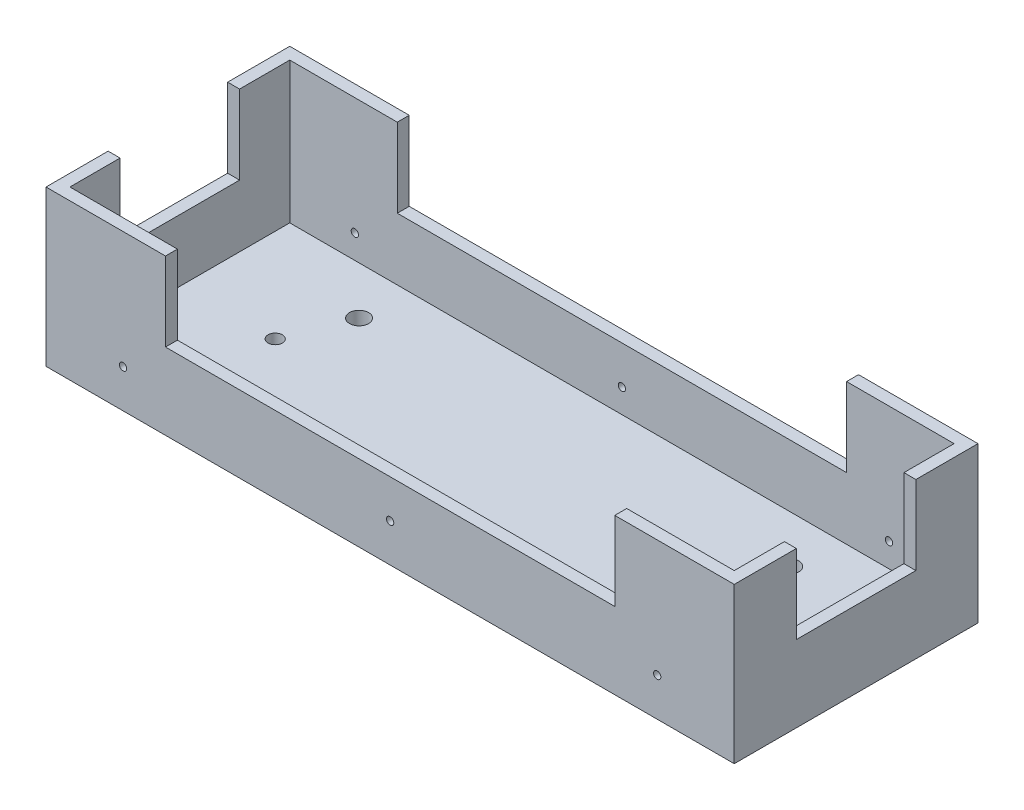
ISO-10303-21;
HEADER;
FILE_DESCRIPTION(('STEP AP214'),'2;1');
FILE_NAME('part.step','',(''),(''),'','','');
FILE_SCHEMA(('AUTOMOTIVE_DESIGN { 1 0 10303 214 1 1 1 1 }'));
ENDSEC;
DATA;
#1=APPLICATION_CONTEXT('core data for automotive mechanical design processes');
#2=APPLICATION_PROTOCOL_DEFINITION('international standard','automotive_design',2000,#1);
#3=PRODUCT_CONTEXT('',#1,'mechanical');
#4=PRODUCT('Part','Part','',(#3));
#5=PRODUCT_RELATED_PRODUCT_CATEGORY('part','',(#4));
#6=PRODUCT_DEFINITION_FORMATION('','',#4);
#7=PRODUCT_DEFINITION_CONTEXT('part definition',#1,'design');
#8=PRODUCT_DEFINITION('design','',#6,#7);
#9=PRODUCT_DEFINITION_SHAPE('','',#8);
#10=(LENGTH_UNIT() NAMED_UNIT(*) SI_UNIT(.MILLI.,.METRE.));
#11=(NAMED_UNIT(*) PLANE_ANGLE_UNIT() SI_UNIT($,.RADIAN.));
#12=(NAMED_UNIT(*) SI_UNIT($,.STERADIAN.) SOLID_ANGLE_UNIT());
#13=UNCERTAINTY_MEASURE_WITH_UNIT(LENGTH_MEASURE(1.E-05),#10,'distance_accuracy_value','');
#14=(GEOMETRIC_REPRESENTATION_CONTEXT(3) GLOBAL_UNCERTAINTY_ASSIGNED_CONTEXT((#13)) GLOBAL_UNIT_ASSIGNED_CONTEXT((#10,
#11,#12)) REPRESENTATION_CONTEXT('',''));
#15=CARTESIAN_POINT('',(0.,0.,0.));
#16=DIRECTION('',(0.,0.,1.));
#17=DIRECTION('',(1.,0.,0.));
#18=AXIS2_PLACEMENT_3D('',#15,#16,#17);
#19=CARTESIAN_POINT('',(0.,16.,0.));
#20=DIRECTION('',(0.,-1.,0.));
#21=DIRECTION('',(0.,0.,-1.));
#22=AXIS2_PLACEMENT_3D('',#19,#20,#21);
#23=PLANE('',#22);
#24=DIRECTION('',(0.,0.,-1.));
#25=VECTOR('',#24,1.);
#26=CARTESIAN_POINT('',(-47.,16.,23.));
#27=LINE('',#26,#25);
#28=CARTESIAN_POINT('',(-47.,16.,25.5));
#29=VERTEX_POINT('',#28);
#30=CARTESIAN_POINT('',(-47.,16.,23.));
#31=VERTEX_POINT('',#30);
#32=EDGE_CURVE('E57',#29,#31,#27,.T.);
#33=ORIENTED_EDGE('',*,*,#32,.F.);
#34=DIRECTION('',(-1.,0.,0.));
#35=VECTOR('',#34,1.);
#36=CARTESIAN_POINT('',(0.,16.,25.5));
#37=LINE('',#36,#35);
#38=CARTESIAN_POINT('',(47.,16.,25.5));
#39=VERTEX_POINT('',#38);
#40=EDGE_CURVE('E390',#39,#29,#37,.T.);
#41=ORIENTED_EDGE('',*,*,#40,.F.);
#42=DIRECTION('',(0.,0.,1.));
#43=VECTOR('',#42,1.);
#44=CARTESIAN_POINT('',(47.,16.,23.));
#45=LINE('',#44,#43);
#46=CARTESIAN_POINT('',(47.,16.,23.));
#47=VERTEX_POINT('',#46);
#48=EDGE_CURVE('E226',#47,#39,#45,.T.);
#49=ORIENTED_EDGE('',*,*,#48,.F.);
#50=DIRECTION('',(-1.,0.,0.));
#51=VECTOR('',#50,1.);
#52=CARTESIAN_POINT('',(0.,16.,23.));
#53=LINE('',#52,#51);
#54=EDGE_CURVE('E331',#47,#31,#53,.T.);
#55=ORIENTED_EDGE('',*,*,#54,.T.);
#56=EDGE_LOOP('',(#33,#41,#49,#55));
#57=FACE_BOUND('',#56,.T.);
#58=ADVANCED_FACE('F32',(#57),#23,.F.);
#59=DIRECTION('',(-1.,0.,0.));
#60=VECTOR('',#59,1.);
#61=CARTESIAN_POINT('',(-72.,16.,12.5));
#62=LINE('',#61,#60);
#63=CARTESIAN_POINT('',(-69.5,16.,12.5));
#64=VERTEX_POINT('',#63);
#65=CARTESIAN_POINT('',(-72.,16.,12.5));
#66=VERTEX_POINT('',#65);
#67=EDGE_CURVE('E219',#64,#66,#62,.T.);
#68=ORIENTED_EDGE('',*,*,#67,.F.);
#69=DIRECTION('',(0.,0.,-1.));
#70=VECTOR('',#69,1.);
#71=CARTESIAN_POINT('',(-69.5,16.,0.));
#72=LINE('',#71,#70);
#73=CARTESIAN_POINT('',(-69.5,16.,-12.5));
#74=VERTEX_POINT('',#73);
#75=EDGE_CURVE('E344',#64,#74,#72,.T.);
#76=ORIENTED_EDGE('',*,*,#75,.T.);
#77=DIRECTION('',(1.,0.,0.));
#78=VECTOR('',#77,1.);
#79=CARTESIAN_POINT('',(-72.,16.,-12.5));
#80=LINE('',#79,#78);
#81=CARTESIAN_POINT('',(-72.,16.,-12.5));
#82=VERTEX_POINT('',#81);
#83=EDGE_CURVE('E294',#82,#74,#80,.T.);
#84=ORIENTED_EDGE('',*,*,#83,.F.);
#85=DIRECTION('',(0.,0.,-1.));
#86=VECTOR('',#85,1.);
#87=CARTESIAN_POINT('',(-72.,16.,0.));
#88=LINE('',#87,#86);
#89=EDGE_CURVE('E49',#66,#82,#88,.T.);
#90=ORIENTED_EDGE('',*,*,#89,.F.);
#91=EDGE_LOOP('',(#68,#76,#84,#90));
#92=FACE_BOUND('',#91,.T.);
#93=ADVANCED_FACE('F452',(#92),#23,.F.);
#94=DIRECTION('',(-1.,0.,0.));
#95=VECTOR('',#94,1.);
#96=CARTESIAN_POINT('',(72.,16.,12.5));
#97=LINE('',#96,#95);
#98=CARTESIAN_POINT('',(72.,16.,12.5));
#99=VERTEX_POINT('',#98);
#100=CARTESIAN_POINT('',(69.5,16.,12.5));
#101=VERTEX_POINT('',#100);
#102=EDGE_CURVE('E222',#99,#101,#97,.T.);
#103=ORIENTED_EDGE('',*,*,#102,.F.);
#104=DIRECTION('',(0.,0.,1.));
#105=VECTOR('',#104,1.);
#106=CARTESIAN_POINT('',(72.,16.,0.));
#107=LINE('',#106,#105);
#108=CARTESIAN_POINT('',(72.,16.,-12.5));
#109=VERTEX_POINT('',#108);
#110=EDGE_CURVE('E385',#109,#99,#107,.T.);
#111=ORIENTED_EDGE('',*,*,#110,.F.);
#112=DIRECTION('',(1.,0.,0.));
#113=VECTOR('',#112,1.);
#114=CARTESIAN_POINT('',(72.,16.,-12.5));
#115=LINE('',#114,#113);
#116=CARTESIAN_POINT('',(69.5,16.,-12.5));
#117=VERTEX_POINT('',#116);
#118=EDGE_CURVE('E266',#117,#109,#115,.T.);
#119=ORIENTED_EDGE('',*,*,#118,.F.);
#120=DIRECTION('',(0.,0.,1.));
#121=VECTOR('',#120,1.);
#122=CARTESIAN_POINT('',(69.5,16.,0.));
#123=LINE('',#122,#121);
#124=EDGE_CURVE('E354',#117,#101,#123,.T.);
#125=ORIENTED_EDGE('',*,*,#124,.T.);
#126=EDGE_LOOP('',(#103,#111,#119,#125));
#127=FACE_BOUND('',#126,.T.);
#128=ADVANCED_FACE('F484',(#127),#23,.F.);
#129=DIRECTION('',(0.,0.,1.));
#130=VECTOR('',#129,1.);
#131=CARTESIAN_POINT('',(47.,16.,-23.));
#132=LINE('',#131,#130);
#133=CARTESIAN_POINT('',(47.,16.,-25.5));
#134=VERTEX_POINT('',#133);
#135=CARTESIAN_POINT('',(47.,16.,-23.));
#136=VERTEX_POINT('',#135);
#137=EDGE_CURVE('E261',#134,#136,#132,.T.);
#138=ORIENTED_EDGE('',*,*,#137,.F.);
#139=DIRECTION('',(1.,0.,0.));
#140=VECTOR('',#139,1.);
#141=CARTESIAN_POINT('',(0.,16.,-25.5));
#142=LINE('',#141,#140);
#143=CARTESIAN_POINT('',(-47.,16.,-25.5));
#144=VERTEX_POINT('',#143);
#145=EDGE_CURVE('E319',#144,#134,#142,.T.);
#146=ORIENTED_EDGE('',*,*,#145,.F.);
#147=DIRECTION('',(0.,0.,-1.));
#148=VECTOR('',#147,1.);
#149=CARTESIAN_POINT('',(-47.,16.,-23.));
#150=LINE('',#149,#148);
#151=CARTESIAN_POINT('',(-47.,16.,-23.));
#152=VERTEX_POINT('',#151);
#153=EDGE_CURVE('E299',#152,#144,#150,.T.);
#154=ORIENTED_EDGE('',*,*,#153,.F.);
#155=DIRECTION('',(1.,0.,0.));
#156=VECTOR('',#155,1.);
#157=CARTESIAN_POINT('',(0.,16.,-23.));
#158=LINE('',#157,#156);
#159=EDGE_CURVE('E347',#152,#136,#158,.T.);
#160=ORIENTED_EDGE('',*,*,#159,.T.);
#161=EDGE_LOOP('',(#138,#146,#154,#160));
#162=FACE_BOUND('',#161,.T.);
#163=ADVANCED_FACE('F486',(#162),#23,.F.);
#164=CARTESIAN_POINT('',(-72.,3.,-25.5));
#165=DIRECTION('',(1.,0.,0.));
#166=DIRECTION('',(0.,0.,-1.));
#167=AXIS2_PLACEMENT_3D('',#164,#165,#166);
#168=PLANE('',#167);
#169=DIRECTION('',(0.,0.,1.));
#170=VECTOR('',#169,1.);
#171=CARTESIAN_POINT('',(-72.,0.,-25.5));
#172=LINE('',#171,#170);
#173=CARTESIAN_POINT('',(-72.,0.,-25.5));
#174=VERTEX_POINT('',#173);
#175=CARTESIAN_POINT('',(-72.,0.,25.5));
#176=VERTEX_POINT('',#175);
#177=EDGE_CURVE('E371',#174,#176,#172,.T.);
#178=ORIENTED_EDGE('',*,*,#177,.T.);
#179=DIRECTION('',(0.,-1.,0.));
#180=VECTOR('',#179,1.);
#181=CARTESIAN_POINT('',(-72.,3.,25.5));
#182=LINE('',#181,#180);
#183=CARTESIAN_POINT('',(-72.,32.5,25.5));
#184=VERTEX_POINT('',#183);
#185=EDGE_CURVE('E11',#184,#176,#182,.T.);
#186=ORIENTED_EDGE('',*,*,#185,.F.);
#187=DIRECTION('',(0.,0.,1.));
#188=VECTOR('',#187,1.);
#189=CARTESIAN_POINT('',(-72.,32.5,25.5));
#190=LINE('',#189,#188);
#191=CARTESIAN_POINT('',(-72.,32.5,12.5));
#192=VERTEX_POINT('',#191);
#193=EDGE_CURVE('E436',#192,#184,#190,.T.);
#194=ORIENTED_EDGE('',*,*,#193,.F.);
#195=DIRECTION('',(0.,-1.,0.));
#196=VECTOR('',#195,1.);
#197=CARTESIAN_POINT('',(-72.,32.5,12.5));
#198=LINE('',#197,#196);
#199=EDGE_CURVE('E229',#192,#66,#198,.T.);
#200=ORIENTED_EDGE('',*,*,#199,.T.);
#201=ORIENTED_EDGE('',*,*,#89,.T.);
#202=DIRECTION('',(0.,-1.,0.));
#203=VECTOR('',#202,1.);
#204=CARTESIAN_POINT('',(-72.,32.5,-12.5));
#205=LINE('',#204,#203);
#206=CARTESIAN_POINT('',(-72.,32.5,-12.5));
#207=VERTEX_POINT('',#206);
#208=EDGE_CURVE('E325',#207,#82,#205,.T.);
#209=ORIENTED_EDGE('',*,*,#208,.F.);
#210=DIRECTION('',(0.,0.,1.));
#211=VECTOR('',#210,1.);
#212=CARTESIAN_POINT('',(-72.,32.5,-25.5));
#213=LINE('',#212,#211);
#214=CARTESIAN_POINT('',(-72.,32.5,-25.5));
#215=VERTEX_POINT('',#214);
#216=EDGE_CURVE('E298',#215,#207,#213,.T.);
#217=ORIENTED_EDGE('',*,*,#216,.F.);
#218=DIRECTION('',(0.,-1.,0.));
#219=VECTOR('',#218,1.);
#220=CARTESIAN_POINT('',(-72.,3.,-25.5));
#221=LINE('',#220,#219);
#222=EDGE_CURVE('E362',#215,#174,#221,.T.);
#223=ORIENTED_EDGE('',*,*,#222,.T.);
#224=EDGE_LOOP('',(#178,#186,#194,#200,#201,#209,#217,#223));
#225=FACE_BOUND('',#224,.T.);
#226=ADVANCED_FACE('F34',(#225),#168,.F.);
#227=CARTESIAN_POINT('',(72.,3.,25.5));
#228=DIRECTION('',(0.,0.,-1.));
#229=DIRECTION('',(-1.,0.,0.));
#230=AXIS2_PLACEMENT_3D('',#227,#228,#229);
#231=PLANE('',#230);
#232=CARTESIAN_POINT('',(0.,8.,25.5));
#233=DIRECTION('',(0.,0.,1.));
#234=DIRECTION('',(1.,0.,0.));
#235=AXIS2_PLACEMENT_3D('',#232,#233,#234);
#236=CIRCLE('',#235,0.762);
#237=CARTESIAN_POINT('',(0.762000000000003,8.,25.5));
#238=VERTEX_POINT('',#237);
#239=EDGE_CURVE('E827',#238,#238,#236,.T.);
#240=ORIENTED_EDGE('',*,*,#239,.F.);
#241=EDGE_LOOP('',(#240));
#242=FACE_BOUND('',#241,.T.);
#243=CARTESIAN_POINT('',(55.88,8.,25.5));
#244=DIRECTION('',(0.,0.,1.));
#245=DIRECTION('',(1.,0.,0.));
#246=AXIS2_PLACEMENT_3D('',#243,#244,#245);
#247=CIRCLE('',#246,0.761999999999996);
#248=CARTESIAN_POINT('',(56.642,8.,25.5));
#249=VERTEX_POINT('',#248);
#250=EDGE_CURVE('E834',#249,#249,#247,.T.);
#251=ORIENTED_EDGE('',*,*,#250,.F.);
#252=EDGE_LOOP('',(#251));
#253=FACE_BOUND('',#252,.T.);
#254=CARTESIAN_POINT('',(-55.88,8.,25.5));
#255=DIRECTION('',(0.,0.,1.));
#256=DIRECTION('',(1.,0.,0.));
#257=AXIS2_PLACEMENT_3D('',#254,#255,#256);
#258=CIRCLE('',#257,0.761999999999996);
#259=CARTESIAN_POINT('',(-55.118,8.,25.5));
#260=VERTEX_POINT('',#259);
#261=EDGE_CURVE('E848',#260,#260,#258,.T.);
#262=ORIENTED_EDGE('',*,*,#261,.F.);
#263=EDGE_LOOP('',(#262));
#264=FACE_BOUND('',#263,.T.);
#265=DIRECTION('',(1.,0.,0.));
#266=VECTOR('',#265,1.);
#267=CARTESIAN_POINT('',(72.,0.,25.5));
#268=LINE('',#267,#266);
#269=CARTESIAN_POINT('',(72.,0.,25.5));
#270=VERTEX_POINT('',#269);
#271=EDGE_CURVE('E369',#176,#270,#268,.T.);
#272=ORIENTED_EDGE('',*,*,#271,.T.);
#273=DIRECTION('',(0.,-1.,0.));
#274=VECTOR('',#273,1.);
#275=CARTESIAN_POINT('',(72.,3.,25.5));
#276=LINE('',#275,#274);
#277=CARTESIAN_POINT('',(72.,32.5,25.5));
#278=VERTEX_POINT('',#277);
#279=EDGE_CURVE('E41',#278,#270,#276,.T.);
#280=ORIENTED_EDGE('',*,*,#279,.F.);
#281=DIRECTION('',(1.,0.,0.));
#282=VECTOR('',#281,1.);
#283=CARTESIAN_POINT('',(47.,32.5,25.5));
#284=LINE('',#283,#282);
#285=CARTESIAN_POINT('',(47.,32.5,25.5));
#286=VERTEX_POINT('',#285);
#287=EDGE_CURVE('E233',#286,#278,#284,.T.);
#288=ORIENTED_EDGE('',*,*,#287,.F.);
#289=DIRECTION('',(0.,-1.,0.));
#290=VECTOR('',#289,1.);
#291=CARTESIAN_POINT('',(47.,32.5,25.5));
#292=LINE('',#291,#290);
#293=EDGE_CURVE('E246',#286,#39,#292,.T.);
#294=ORIENTED_EDGE('',*,*,#293,.T.);
#295=ORIENTED_EDGE('',*,*,#40,.T.);
#296=DIRECTION('',(0.,-1.,0.));
#297=VECTOR('',#296,1.);
#298=CARTESIAN_POINT('',(-47.,32.5,25.5));
#299=LINE('',#298,#297);
#300=CARTESIAN_POINT('',(-47.,32.5,25.5));
#301=VERTEX_POINT('',#300);
#302=EDGE_CURVE('E441',#301,#29,#299,.T.);
#303=ORIENTED_EDGE('',*,*,#302,.F.);
#304=DIRECTION('',(1.,0.,0.));
#305=VECTOR('',#304,1.);
#306=CARTESIAN_POINT('',(-47.,32.5,25.5));
#307=LINE('',#306,#305);
#308=EDGE_CURVE('E215',#184,#301,#307,.T.);
#309=ORIENTED_EDGE('',*,*,#308,.F.);
#310=ORIENTED_EDGE('',*,*,#185,.T.);
#311=EDGE_LOOP('',(#272,#280,#288,#294,#295,#303,#309,#310));
#312=FACE_BOUND('',#311,.T.);
#313=ADVANCED_FACE('F476',(#242,#253,#264,#312),#231,.F.);
#314=CARTESIAN_POINT('',(72.,3.,-25.5));
#315=DIRECTION('',(-1.,0.,0.));
#316=DIRECTION('',(0.,0.,1.));
#317=AXIS2_PLACEMENT_3D('',#314,#315,#316);
#318=PLANE('',#317);
#319=DIRECTION('',(0.,0.,-1.));
#320=VECTOR('',#319,1.);
#321=CARTESIAN_POINT('',(72.,0.,-25.5));
#322=LINE('',#321,#320);
#323=CARTESIAN_POINT('',(72.,0.,-25.5));
#324=VERTEX_POINT('',#323);
#325=EDGE_CURVE('E367',#270,#324,#322,.T.);
#326=ORIENTED_EDGE('',*,*,#325,.T.);
#327=DIRECTION('',(0.,-1.,0.));
#328=VECTOR('',#327,1.);
#329=CARTESIAN_POINT('',(72.,3.,-25.5));
#330=LINE('',#329,#328);
#331=CARTESIAN_POINT('',(72.,32.5,-25.5));
#332=VERTEX_POINT('',#331);
#333=EDGE_CURVE('E359',#332,#324,#330,.T.);
#334=ORIENTED_EDGE('',*,*,#333,.F.);
#335=DIRECTION('',(0.,0.,-1.));
#336=VECTOR('',#335,1.);
#337=CARTESIAN_POINT('',(72.,32.5,-25.5));
#338=LINE('',#337,#336);
#339=CARTESIAN_POINT('',(72.,32.5,-12.5));
#340=VERTEX_POINT('',#339);
#341=EDGE_CURVE('E273',#340,#332,#338,.T.);
#342=ORIENTED_EDGE('',*,*,#341,.F.);
#343=DIRECTION('',(0.,-1.,0.));
#344=VECTOR('',#343,1.);
#345=CARTESIAN_POINT('',(72.,32.5,-12.5));
#346=LINE('',#345,#344);
#347=EDGE_CURVE('E285',#340,#109,#346,.T.);
#348=ORIENTED_EDGE('',*,*,#347,.T.);
#349=ORIENTED_EDGE('',*,*,#110,.T.);
#350=DIRECTION('',(0.,-1.,0.));
#351=VECTOR('',#350,1.);
#352=CARTESIAN_POINT('',(72.,32.5,12.5));
#353=LINE('',#352,#351);
#354=CARTESIAN_POINT('',(72.,32.5,12.5));
#355=VERTEX_POINT('',#354);
#356=EDGE_CURVE('E258',#355,#99,#353,.T.);
#357=ORIENTED_EDGE('',*,*,#356,.F.);
#358=DIRECTION('',(0.,0.,-1.));
#359=VECTOR('',#358,1.);
#360=CARTESIAN_POINT('',(72.,32.5,25.5));
#361=LINE('',#360,#359);
#362=EDGE_CURVE('E236',#278,#355,#361,.T.);
#363=ORIENTED_EDGE('',*,*,#362,.F.);
#364=ORIENTED_EDGE('',*,*,#279,.T.);
#365=EDGE_LOOP('',(#326,#334,#342,#348,#349,#357,#363,#364));
#366=FACE_BOUND('',#365,.T.);
#367=ADVANCED_FACE('F483',(#366),#318,.F.);
#368=CARTESIAN_POINT('',(72.,3.,-25.5));
#369=DIRECTION('',(0.,0.,1.));
#370=DIRECTION('',(1.,0.,0.));
#371=AXIS2_PLACEMENT_3D('',#368,#369,#370);
#372=PLANE('',#371);
#373=CARTESIAN_POINT('',(0.,8.,-25.5));
#374=DIRECTION('',(0.,0.,1.));
#375=DIRECTION('',(1.,0.,0.));
#376=AXIS2_PLACEMENT_3D('',#373,#374,#375);
#377=CIRCLE('',#376,0.762);
#378=CARTESIAN_POINT('',(0.762000000000003,8.,-25.5));
#379=VERTEX_POINT('',#378);
#380=EDGE_CURVE('E831',#379,#379,#377,.T.);
#381=ORIENTED_EDGE('',*,*,#380,.T.);
#382=EDGE_LOOP('',(#381));
#383=FACE_BOUND('',#382,.T.);
#384=CARTESIAN_POINT('',(55.88,8.,-25.5));
#385=DIRECTION('',(0.,0.,1.));
#386=DIRECTION('',(1.,0.,0.));
#387=AXIS2_PLACEMENT_3D('',#384,#385,#386);
#388=CIRCLE('',#387,0.761999999999996);
#389=CARTESIAN_POINT('',(56.642,8.,-25.5));
#390=VERTEX_POINT('',#389);
#391=EDGE_CURVE('E845',#390,#390,#388,.T.);
#392=ORIENTED_EDGE('',*,*,#391,.T.);
#393=EDGE_LOOP('',(#392));
#394=FACE_BOUND('',#393,.T.);
#395=CARTESIAN_POINT('',(-55.88,8.,-25.5));
#396=DIRECTION('',(0.,0.,1.));
#397=DIRECTION('',(1.,0.,0.));
#398=AXIS2_PLACEMENT_3D('',#395,#396,#397);
#399=CIRCLE('',#398,0.761999999999996);
#400=CARTESIAN_POINT('',(-55.118,8.,-25.5));
#401=VERTEX_POINT('',#400);
#402=EDGE_CURVE('E855',#401,#401,#399,.T.);
#403=ORIENTED_EDGE('',*,*,#402,.T.);
#404=EDGE_LOOP('',(#403));
#405=FACE_BOUND('',#404,.T.);
#406=DIRECTION('',(-1.,0.,0.));
#407=VECTOR('',#406,1.);
#408=CARTESIAN_POINT('',(72.,0.,-25.5));
#409=LINE('',#408,#407);
#410=EDGE_CURVE('E365',#324,#174,#409,.T.);
#411=ORIENTED_EDGE('',*,*,#410,.T.);
#412=ORIENTED_EDGE('',*,*,#222,.F.);
#413=DIRECTION('',(-1.,0.,0.));
#414=VECTOR('',#413,1.);
#415=CARTESIAN_POINT('',(-47.,32.5,-25.5));
#416=LINE('',#415,#414);
#417=CARTESIAN_POINT('',(-47.,32.5,-25.5));
#418=VERTEX_POINT('',#417);
#419=EDGE_CURVE('E295',#418,#215,#416,.T.);
#420=ORIENTED_EDGE('',*,*,#419,.F.);
#421=DIRECTION('',(0.,-1.,0.));
#422=VECTOR('',#421,1.);
#423=CARTESIAN_POINT('',(-47.,32.5,-25.5));
#424=LINE('',#423,#422);
#425=EDGE_CURVE('E310',#418,#144,#424,.T.);
#426=ORIENTED_EDGE('',*,*,#425,.T.);
#427=ORIENTED_EDGE('',*,*,#145,.T.);
#428=DIRECTION('',(0.,-1.,0.));
#429=VECTOR('',#428,1.);
#430=CARTESIAN_POINT('',(47.,32.5,-25.5));
#431=LINE('',#430,#429);
#432=CARTESIAN_POINT('',(47.,32.5,-25.5));
#433=VERTEX_POINT('',#432);
#434=EDGE_CURVE('E278',#433,#134,#431,.T.);
#435=ORIENTED_EDGE('',*,*,#434,.F.);
#436=DIRECTION('',(-1.,0.,0.));
#437=VECTOR('',#436,1.);
#438=CARTESIAN_POINT('',(47.,32.5,-25.5));
#439=LINE('',#438,#437);
#440=EDGE_CURVE('E276',#332,#433,#439,.T.);
#441=ORIENTED_EDGE('',*,*,#440,.F.);
#442=ORIENTED_EDGE('',*,*,#333,.T.);
#443=EDGE_LOOP('',(#411,#412,#420,#426,#427,#435,#441,#442));
#444=FACE_BOUND('',#443,.T.);
#445=ADVANCED_FACE('F468',(#383,#394,#405,#444),#372,.F.);
#446=CARTESIAN_POINT('',(0.,0.,0.));
#447=DIRECTION('',(0.,-1.,0.));
#448=DIRECTION('',(0.,0.,-1.));
#449=AXIS2_PLACEMENT_3D('',#446,#447,#448);
#450=PLANE('',#449);
#451=CARTESIAN_POINT('',(50.,0.,-0.450000000000011));
#452=DIRECTION('',(0.,-1.,0.));
#453=DIRECTION('',(0.,0.,1.));
#454=AXIS2_PLACEMENT_3D('',#451,#452,#453);
#455=CIRCLE('',#454,1.5);
#456=CARTESIAN_POINT('',(50.,0.,1.04999999999999));
#457=VERTEX_POINT('',#456);
#458=EDGE_CURVE('E858',#457,#457,#455,.T.);
#459=ORIENTED_EDGE('',*,*,#458,.F.);
#460=EDGE_LOOP('',(#459));
#461=FACE_BOUND('',#460,.T.);
#462=CARTESIAN_POINT('',(-50.,0.,-0.450000000000011));
#463=DIRECTION('',(0.,-1.,0.));
#464=DIRECTION('',(0.,0.,-1.));
#465=AXIS2_PLACEMENT_3D('',#462,#463,#464);
#466=CIRCLE('',#465,1.5);
#467=CARTESIAN_POINT('',(-50.,0.,-1.95000000000002));
#468=VERTEX_POINT('',#467);
#469=EDGE_CURVE('E862',#468,#468,#466,.T.);
#470=ORIENTED_EDGE('',*,*,#469,.F.);
#471=EDGE_LOOP('',(#470));
#472=FACE_BOUND('',#471,.T.);
#473=CARTESIAN_POINT('',(45.,0.,-13.));
#474=DIRECTION('',(0.,-1.,0.));
#475=DIRECTION('',(0.,0.,1.));
#476=AXIS2_PLACEMENT_3D('',#473,#474,#475);
#477=CIRCLE('',#476,2.);
#478=CARTESIAN_POINT('',(45.,0.,-11.));
#479=VERTEX_POINT('',#478);
#480=EDGE_CURVE('E866',#479,#479,#477,.T.);
#481=ORIENTED_EDGE('',*,*,#480,.F.);
#482=EDGE_LOOP('',(#481));
#483=FACE_BOUND('',#482,.T.);
#484=CARTESIAN_POINT('',(45.,0.,13.));
#485=DIRECTION('',(0.,-1.,0.));
#486=DIRECTION('',(0.,0.,1.));
#487=AXIS2_PLACEMENT_3D('',#484,#485,#486);
#488=CIRCLE('',#487,2.);
#489=CARTESIAN_POINT('',(45.,0.,15.));
#490=VERTEX_POINT('',#489);
#491=EDGE_CURVE('E870',#490,#490,#488,.T.);
#492=ORIENTED_EDGE('',*,*,#491,.F.);
#493=EDGE_LOOP('',(#492));
#494=FACE_BOUND('',#493,.T.);
#495=CARTESIAN_POINT('',(-45.,0.,13.));
#496=DIRECTION('',(0.,-1.,0.));
#497=DIRECTION('',(0.,0.,-1.));
#498=AXIS2_PLACEMENT_3D('',#495,#496,#497);
#499=CIRCLE('',#498,2.);
#500=CARTESIAN_POINT('',(-45.,0.,11.));
#501=VERTEX_POINT('',#500);
#502=EDGE_CURVE('E874',#501,#501,#499,.T.);
#503=ORIENTED_EDGE('',*,*,#502,.F.);
#504=EDGE_LOOP('',(#503));
#505=FACE_BOUND('',#504,.T.);
#506=CARTESIAN_POINT('',(-45.,0.,-13.));
#507=DIRECTION('',(0.,-1.,0.));
#508=DIRECTION('',(0.,0.,-1.));
#509=AXIS2_PLACEMENT_3D('',#506,#507,#508);
#510=CIRCLE('',#509,2.);
#511=CARTESIAN_POINT('',(-45.,0.,-15.));
#512=VERTEX_POINT('',#511);
#513=EDGE_CURVE('E878',#512,#512,#510,.T.);
#514=ORIENTED_EDGE('',*,*,#513,.F.);
#515=EDGE_LOOP('',(#514));
#516=FACE_BOUND('',#515,.T.);
#517=ORIENTED_EDGE('',*,*,#177,.F.);
#518=ORIENTED_EDGE('',*,*,#410,.F.);
#519=ORIENTED_EDGE('',*,*,#325,.F.);
#520=ORIENTED_EDGE('',*,*,#271,.F.);
#521=EDGE_LOOP('',(#517,#518,#519,#520));
#522=FACE_BOUND('',#521,.T.);
#523=ADVANCED_FACE('F473',(#461,#472,#483,#494,#505,#516,#522),#450,.T.);
#524=CARTESIAN_POINT('',(0.,16.,23.));
#525=DIRECTION('',(0.,0.,1.));
#526=DIRECTION('',(1.,0.,0.));
#527=AXIS2_PLACEMENT_3D('',#524,#525,#526);
#528=PLANE('',#527);
#529=CARTESIAN_POINT('',(0.,8.,23.));
#530=DIRECTION('',(0.,0.,1.));
#531=DIRECTION('',(1.,0.,0.));
#532=AXIS2_PLACEMENT_3D('',#529,#530,#531);
#533=CIRCLE('',#532,0.762);
#534=CARTESIAN_POINT('',(0.762000000000003,8.,23.));
#535=VERTEX_POINT('',#534);
#536=EDGE_CURVE('E830',#535,#535,#533,.T.);
#537=ORIENTED_EDGE('',*,*,#536,.T.);
#538=EDGE_LOOP('',(#537));
#539=FACE_BOUND('',#538,.T.);
#540=CARTESIAN_POINT('',(55.88,8.,23.));
#541=DIRECTION('',(0.,0.,1.));
#542=DIRECTION('',(1.,0.,0.));
#543=AXIS2_PLACEMENT_3D('',#540,#541,#542);
#544=CIRCLE('',#543,0.761999999999996);
#545=CARTESIAN_POINT('',(56.642,8.,23.));
#546=VERTEX_POINT('',#545);
#547=EDGE_CURVE('E842',#546,#546,#544,.T.);
#548=ORIENTED_EDGE('',*,*,#547,.T.);
#549=EDGE_LOOP('',(#548));
#550=FACE_BOUND('',#549,.T.);
#551=CARTESIAN_POINT('',(-55.88,8.,23.));
#552=DIRECTION('',(0.,0.,1.));
#553=DIRECTION('',(1.,0.,0.));
#554=AXIS2_PLACEMENT_3D('',#551,#552,#553);
#555=CIRCLE('',#554,0.761999999999996);
#556=CARTESIAN_POINT('',(-55.118,8.,23.));
#557=VERTEX_POINT('',#556);
#558=EDGE_CURVE('E852',#557,#557,#555,.T.);
#559=ORIENTED_EDGE('',*,*,#558,.T.);
#560=EDGE_LOOP('',(#559));
#561=FACE_BOUND('',#560,.T.);
#562=DIRECTION('',(0.,-1.,0.));
#563=VECTOR('',#562,1.);
#564=CARTESIAN_POINT('',(69.5,16.,23.));
#565=LINE('',#564,#563);
#566=CARTESIAN_POINT('',(69.5,32.5,23.));
#567=VERTEX_POINT('',#566);
#568=CARTESIAN_POINT('',(69.5,3.,23.));
#569=VERTEX_POINT('',#568);
#570=EDGE_CURVE('E392',#567,#569,#565,.T.);
#571=ORIENTED_EDGE('',*,*,#570,.T.);
#572=DIRECTION('',(-1.,0.,0.));
#573=VECTOR('',#572,1.);
#574=CARTESIAN_POINT('',(0.,3.,23.));
#575=LINE('',#574,#573);
#576=CARTESIAN_POINT('',(-69.5,3.,23.));
#577=VERTEX_POINT('',#576);
#578=EDGE_CURVE('E374',#569,#577,#575,.T.);
#579=ORIENTED_EDGE('',*,*,#578,.T.);
#580=DIRECTION('',(0.,-1.,0.));
#581=VECTOR('',#580,1.);
#582=CARTESIAN_POINT('',(-69.5,16.,23.));
#583=LINE('',#582,#581);
#584=CARTESIAN_POINT('',(-69.5,32.5,23.));
#585=VERTEX_POINT('',#584);
#586=EDGE_CURVE('E205',#585,#577,#583,.T.);
#587=ORIENTED_EDGE('',*,*,#586,.F.);
#588=DIRECTION('',(-1.,0.,0.));
#589=VECTOR('',#588,1.);
#590=CARTESIAN_POINT('',(-69.5,32.5,23.));
#591=LINE('',#590,#589);
#592=CARTESIAN_POINT('',(-47.,32.5,23.));
#593=VERTEX_POINT('',#592);
#594=EDGE_CURVE('E196',#593,#585,#591,.T.);
#595=ORIENTED_EDGE('',*,*,#594,.F.);
#596=DIRECTION('',(0.,-1.,0.));
#597=VECTOR('',#596,1.);
#598=CARTESIAN_POINT('',(-47.,32.5,23.));
#599=LINE('',#598,#597);
#600=EDGE_CURVE('E202',#593,#31,#599,.T.);
#601=ORIENTED_EDGE('',*,*,#600,.T.);
#602=ORIENTED_EDGE('',*,*,#54,.F.);
#603=DIRECTION('',(0.,-1.,0.));
#604=VECTOR('',#603,1.);
#605=CARTESIAN_POINT('',(47.,32.5,23.));
#606=LINE('',#605,#604);
#607=CARTESIAN_POINT('',(47.,32.5,23.));
#608=VERTEX_POINT('',#607);
#609=EDGE_CURVE('E252',#608,#47,#606,.T.);
#610=ORIENTED_EDGE('',*,*,#609,.F.);
#611=DIRECTION('',(-1.,0.,0.));
#612=VECTOR('',#611,1.);
#613=CARTESIAN_POINT('',(69.5,32.5,23.));
#614=LINE('',#613,#612);
#615=EDGE_CURVE('E243',#567,#608,#614,.T.);
#616=ORIENTED_EDGE('',*,*,#615,.F.);
#617=EDGE_LOOP('',(#571,#579,#587,#595,#601,#602,#610,#616));
#618=FACE_BOUND('',#617,.T.);
#619=ADVANCED_FACE('F199',(#539,#550,#561,#618),#528,.F.);
#620=CARTESIAN_POINT('',(69.5,16.,0.));
#621=DIRECTION('',(1.,0.,0.));
#622=DIRECTION('',(0.,0.,-1.));
#623=AXIS2_PLACEMENT_3D('',#620,#621,#622);
#624=PLANE('',#623);
#625=DIRECTION('',(0.,-1.,0.));
#626=VECTOR('',#625,1.);
#627=CARTESIAN_POINT('',(69.5,16.,-23.));
#628=LINE('',#627,#626);
#629=CARTESIAN_POINT('',(69.5,32.5,-23.));
#630=VERTEX_POINT('',#629);
#631=CARTESIAN_POINT('',(69.5,3.,-23.));
#632=VERTEX_POINT('',#631);
#633=EDGE_CURVE('E397',#630,#632,#628,.T.);
#634=ORIENTED_EDGE('',*,*,#633,.T.);
#635=DIRECTION('',(0.,0.,1.));
#636=VECTOR('',#635,1.);
#637=CARTESIAN_POINT('',(69.5,3.,0.));
#638=LINE('',#637,#636);
#639=EDGE_CURVE('E376',#632,#569,#638,.T.);
#640=ORIENTED_EDGE('',*,*,#639,.T.);
#641=ORIENTED_EDGE('',*,*,#570,.F.);
#642=DIRECTION('',(0.,0.,1.));
#643=VECTOR('',#642,1.);
#644=CARTESIAN_POINT('',(69.5,32.5,12.5));
#645=LINE('',#644,#643);
#646=CARTESIAN_POINT('',(69.5,32.5,12.5));
#647=VERTEX_POINT('',#646);
#648=EDGE_CURVE('E240',#647,#567,#645,.T.);
#649=ORIENTED_EDGE('',*,*,#648,.F.);
#650=DIRECTION('',(0.,-1.,0.));
#651=VECTOR('',#650,1.);
#652=CARTESIAN_POINT('',(69.5,32.5,12.5));
#653=LINE('',#652,#651);
#654=EDGE_CURVE('E255',#647,#101,#653,.T.);
#655=ORIENTED_EDGE('',*,*,#654,.T.);
#656=ORIENTED_EDGE('',*,*,#124,.F.);
#657=DIRECTION('',(0.,-1.,0.));
#658=VECTOR('',#657,1.);
#659=CARTESIAN_POINT('',(69.5,32.5,-12.5));
#660=LINE('',#659,#658);
#661=CARTESIAN_POINT('',(69.5,32.5,-12.5));
#662=VERTEX_POINT('',#661);
#663=EDGE_CURVE('E288',#662,#117,#660,.T.);
#664=ORIENTED_EDGE('',*,*,#663,.F.);
#665=DIRECTION('',(0.,0.,1.));
#666=VECTOR('',#665,1.);
#667=CARTESIAN_POINT('',(69.5,32.5,-12.5));
#668=LINE('',#667,#666);
#669=EDGE_CURVE('E269',#630,#662,#668,.T.);
#670=ORIENTED_EDGE('',*,*,#669,.F.);
#671=EDGE_LOOP('',(#634,#640,#641,#649,#655,#656,#664,#670));
#672=FACE_BOUND('',#671,.T.);
#673=ADVANCED_FACE('F403',(#672),#624,.F.);
#674=CARTESIAN_POINT('',(0.,16.,-23.));
#675=DIRECTION('',(0.,0.,-1.));
#676=DIRECTION('',(-1.,0.,0.));
#677=AXIS2_PLACEMENT_3D('',#674,#675,#676);
#678=PLANE('',#677);
#679=CARTESIAN_POINT('',(0.,8.,-23.));
#680=DIRECTION('',(0.,0.,-1.));
#681=DIRECTION('',(-1.,0.,0.));
#682=AXIS2_PLACEMENT_3D('',#679,#680,#681);
#683=CIRCLE('',#682,0.762);
#684=CARTESIAN_POINT('',(-0.761999999999997,8.,-23.));
#685=VERTEX_POINT('',#684);
#686=EDGE_CURVE('E36',#685,#685,#683,.T.);
#687=ORIENTED_EDGE('',*,*,#686,.T.);
#688=EDGE_LOOP('',(#687));
#689=FACE_BOUND('',#688,.T.);
#690=CARTESIAN_POINT('',(55.88,8.,-23.));
#691=DIRECTION('',(0.,0.,-1.));
#692=DIRECTION('',(-1.,0.,0.));
#693=AXIS2_PLACEMENT_3D('',#690,#691,#692);
#694=CIRCLE('',#693,0.761999999999996);
#695=CARTESIAN_POINT('',(55.118,8.,-23.));
#696=VERTEX_POINT('',#695);
#697=EDGE_CURVE('E841',#696,#696,#694,.T.);
#698=ORIENTED_EDGE('',*,*,#697,.T.);
#699=EDGE_LOOP('',(#698));
#700=FACE_BOUND('',#699,.T.);
#701=CARTESIAN_POINT('',(-55.88,8.,-23.));
#702=DIRECTION('',(0.,0.,-1.));
#703=DIRECTION('',(-1.,0.,0.));
#704=AXIS2_PLACEMENT_3D('',#701,#702,#703);
#705=CIRCLE('',#704,0.761999999999996);
#706=CARTESIAN_POINT('',(-56.642,8.,-23.));
#707=VERTEX_POINT('',#706);
#708=EDGE_CURVE('E851',#707,#707,#705,.T.);
#709=ORIENTED_EDGE('',*,*,#708,.T.);
#710=EDGE_LOOP('',(#709));
#711=FACE_BOUND('',#710,.T.);
#712=DIRECTION('',(0.,-1.,0.));
#713=VECTOR('',#712,1.);
#714=CARTESIAN_POINT('',(-69.5,16.,-23.));
#715=LINE('',#714,#713);
#716=CARTESIAN_POINT('',(-69.5,32.5,-23.));
#717=VERTEX_POINT('',#716);
#718=CARTESIAN_POINT('',(-69.5,3.,-23.));
#719=VERTEX_POINT('',#718);
#720=EDGE_CURVE('E394',#717,#719,#715,.T.);
#721=ORIENTED_EDGE('',*,*,#720,.T.);
#722=DIRECTION('',(1.,0.,0.));
#723=VECTOR('',#722,1.);
#724=CARTESIAN_POINT('',(0.,3.,-23.));
#725=LINE('',#724,#723);
#726=EDGE_CURVE('E379',#719,#632,#725,.T.);
#727=ORIENTED_EDGE('',*,*,#726,.T.);
#728=ORIENTED_EDGE('',*,*,#633,.F.);
#729=DIRECTION('',(1.,0.,0.));
#730=VECTOR('',#729,1.);
#731=CARTESIAN_POINT('',(69.5,32.5,-23.));
#732=LINE('',#731,#730);
#733=CARTESIAN_POINT('',(47.,32.5,-23.));
#734=VERTEX_POINT('',#733);
#735=EDGE_CURVE('E265',#734,#630,#732,.T.);
#736=ORIENTED_EDGE('',*,*,#735,.F.);
#737=DIRECTION('',(0.,-1.,0.));
#738=VECTOR('',#737,1.);
#739=CARTESIAN_POINT('',(47.,32.5,-23.));
#740=LINE('',#739,#738);
#741=EDGE_CURVE('E291',#734,#136,#740,.T.);
#742=ORIENTED_EDGE('',*,*,#741,.T.);
#743=ORIENTED_EDGE('',*,*,#159,.F.);
#744=DIRECTION('',(0.,-1.,0.));
#745=VECTOR('',#744,1.);
#746=CARTESIAN_POINT('',(-47.,32.5,-23.));
#747=LINE('',#746,#745);
#748=CARTESIAN_POINT('',(-47.,32.5,-23.));
#749=VERTEX_POINT('',#748);
#750=EDGE_CURVE('E326',#749,#152,#747,.T.);
#751=ORIENTED_EDGE('',*,*,#750,.F.);
#752=DIRECTION('',(1.,0.,0.));
#753=VECTOR('',#752,1.);
#754=CARTESIAN_POINT('',(-69.5,32.5,-23.));
#755=LINE('',#754,#753);
#756=EDGE_CURVE('E306',#717,#749,#755,.T.);
#757=ORIENTED_EDGE('',*,*,#756,.F.);
#758=EDGE_LOOP('',(#721,#727,#728,#736,#742,#743,#751,#757));
#759=FACE_BOUND('',#758,.T.);
#760=ADVANCED_FACE('F425',(#689,#700,#711,#759),#678,.F.);
#761=CARTESIAN_POINT('',(-69.5,16.,0.));
#762=DIRECTION('',(-1.,0.,0.));
#763=DIRECTION('',(0.,0.,1.));
#764=AXIS2_PLACEMENT_3D('',#761,#762,#763);
#765=PLANE('',#764);
#766=ORIENTED_EDGE('',*,*,#586,.T.);
#767=DIRECTION('',(0.,0.,-1.));
#768=VECTOR('',#767,1.);
#769=CARTESIAN_POINT('',(-69.5,3.,0.));
#770=LINE('',#769,#768);
#771=EDGE_CURVE('E382',#577,#719,#770,.T.);
#772=ORIENTED_EDGE('',*,*,#771,.T.);
#773=ORIENTED_EDGE('',*,*,#720,.F.);
#774=DIRECTION('',(0.,0.,-1.));
#775=VECTOR('',#774,1.);
#776=CARTESIAN_POINT('',(-69.5,32.5,-12.5));
#777=LINE('',#776,#775);
#778=CARTESIAN_POINT('',(-69.5,32.5,-12.5));
#779=VERTEX_POINT('',#778);
#780=EDGE_CURVE('E303',#779,#717,#777,.T.);
#781=ORIENTED_EDGE('',*,*,#780,.F.);
#782=DIRECTION('',(0.,-1.,0.));
#783=VECTOR('',#782,1.);
#784=CARTESIAN_POINT('',(-69.5,32.5,-12.5));
#785=LINE('',#784,#783);
#786=EDGE_CURVE('E322',#779,#74,#785,.T.);
#787=ORIENTED_EDGE('',*,*,#786,.T.);
#788=ORIENTED_EDGE('',*,*,#75,.F.);
#789=DIRECTION('',(0.,-1.,0.));
#790=VECTOR('',#789,1.);
#791=CARTESIAN_POINT('',(-69.5,32.5,12.5));
#792=LINE('',#791,#790);
#793=CARTESIAN_POINT('',(-69.5,32.5,12.5));
#794=VERTEX_POINT('',#793);
#795=EDGE_CURVE('E223',#794,#64,#792,.T.);
#796=ORIENTED_EDGE('',*,*,#795,.F.);
#797=DIRECTION('',(0.,0.,-1.));
#798=VECTOR('',#797,1.);
#799=CARTESIAN_POINT('',(-69.5,32.5,12.5));
#800=LINE('',#799,#798);
#801=EDGE_CURVE('E208',#585,#794,#800,.T.);
#802=ORIENTED_EDGE('',*,*,#801,.F.);
#803=EDGE_LOOP('',(#766,#772,#773,#781,#787,#788,#796,#802));
#804=FACE_BOUND('',#803,.T.);
#805=ADVANCED_FACE('F430',(#804),#765,.F.);
#806=CARTESIAN_POINT('',(0.,3.,0.));
#807=DIRECTION('',(0.,-1.,0.));
#808=DIRECTION('',(0.,0.,-1.));
#809=AXIS2_PLACEMENT_3D('',#806,#807,#808);
#810=PLANE('',#809);
#811=CARTESIAN_POINT('',(50.,3.,-0.450000000000011));
#812=DIRECTION('',(0.,-1.,0.));
#813=DIRECTION('',(0.,0.,-1.));
#814=AXIS2_PLACEMENT_3D('',#811,#812,#813);
#815=CIRCLE('',#814,1.5);
#816=CARTESIAN_POINT('',(50.,3.,-1.95000000000002));
#817=VERTEX_POINT('',#816);
#818=EDGE_CURVE('E861',#817,#817,#815,.T.);
#819=ORIENTED_EDGE('',*,*,#818,.T.);
#820=EDGE_LOOP('',(#819));
#821=FACE_BOUND('',#820,.T.);
#822=CARTESIAN_POINT('',(-50.,3.,-0.450000000000011));
#823=DIRECTION('',(0.,-1.,0.));
#824=DIRECTION('',(0.,0.,-1.));
#825=AXIS2_PLACEMENT_3D('',#822,#823,#824);
#826=CIRCLE('',#825,1.5);
#827=CARTESIAN_POINT('',(-50.,3.,-1.95000000000002));
#828=VERTEX_POINT('',#827);
#829=EDGE_CURVE('E865',#828,#828,#826,.T.);
#830=ORIENTED_EDGE('',*,*,#829,.T.);
#831=EDGE_LOOP('',(#830));
#832=FACE_BOUND('',#831,.T.);
#833=CARTESIAN_POINT('',(45.,3.,-13.));
#834=DIRECTION('',(0.,-1.,0.));
#835=DIRECTION('',(0.,0.,-1.));
#836=AXIS2_PLACEMENT_3D('',#833,#834,#835);
#837=CIRCLE('',#836,2.);
#838=CARTESIAN_POINT('',(45.,3.,-15.));
#839=VERTEX_POINT('',#838);
#840=EDGE_CURVE('E869',#839,#839,#837,.T.);
#841=ORIENTED_EDGE('',*,*,#840,.T.);
#842=EDGE_LOOP('',(#841));
#843=FACE_BOUND('',#842,.T.);
#844=CARTESIAN_POINT('',(45.,3.,13.));
#845=DIRECTION('',(0.,-1.,0.));
#846=DIRECTION('',(0.,0.,-1.));
#847=AXIS2_PLACEMENT_3D('',#844,#845,#846);
#848=CIRCLE('',#847,2.);
#849=CARTESIAN_POINT('',(45.,3.,11.));
#850=VERTEX_POINT('',#849);
#851=EDGE_CURVE('E873',#850,#850,#848,.T.);
#852=ORIENTED_EDGE('',*,*,#851,.T.);
#853=EDGE_LOOP('',(#852));
#854=FACE_BOUND('',#853,.T.);
#855=CARTESIAN_POINT('',(-45.,3.,13.));
#856=DIRECTION('',(0.,-1.,0.));
#857=DIRECTION('',(0.,0.,-1.));
#858=AXIS2_PLACEMENT_3D('',#855,#856,#857);
#859=CIRCLE('',#858,2.);
#860=CARTESIAN_POINT('',(-45.,3.,11.));
#861=VERTEX_POINT('',#860);
#862=EDGE_CURVE('E877',#861,#861,#859,.T.);
#863=ORIENTED_EDGE('',*,*,#862,.T.);
#864=EDGE_LOOP('',(#863));
#865=FACE_BOUND('',#864,.T.);
#866=CARTESIAN_POINT('',(-45.,3.,-13.));
#867=DIRECTION('',(0.,-1.,0.));
#868=DIRECTION('',(0.,0.,-1.));
#869=AXIS2_PLACEMENT_3D('',#866,#867,#868);
#870=CIRCLE('',#869,2.);
#871=CARTESIAN_POINT('',(-45.,3.,-15.));
#872=VERTEX_POINT('',#871);
#873=EDGE_CURVE('E443',#872,#872,#870,.T.);
#874=ORIENTED_EDGE('',*,*,#873,.T.);
#875=EDGE_LOOP('',(#874));
#876=FACE_BOUND('',#875,.T.);
#877=ORIENTED_EDGE('',*,*,#578,.F.);
#878=ORIENTED_EDGE('',*,*,#639,.F.);
#879=ORIENTED_EDGE('',*,*,#726,.F.);
#880=ORIENTED_EDGE('',*,*,#771,.F.);
#881=EDGE_LOOP('',(#877,#878,#879,#880));
#882=FACE_BOUND('',#881,.T.);
#883=ADVANCED_FACE('F428',(#821,#832,#843,#854,#865,#876,#882),#810,.F.);
#884=CARTESIAN_POINT('',(-72.,32.5,-12.5));
#885=DIRECTION('',(0.,0.,-1.));
#886=DIRECTION('',(-1.,0.,0.));
#887=AXIS2_PLACEMENT_3D('',#884,#885,#886);
#888=PLANE('',#887);
#889=ORIENTED_EDGE('',*,*,#83,.T.);
#890=ORIENTED_EDGE('',*,*,#786,.F.);
#891=DIRECTION('',(1.,0.,0.));
#892=VECTOR('',#891,1.);
#893=CARTESIAN_POINT('',(-72.,32.5,-12.5));
#894=LINE('',#893,#892);
#895=EDGE_CURVE('E301',#207,#779,#894,.T.);
#896=ORIENTED_EDGE('',*,*,#895,.F.);
#897=ORIENTED_EDGE('',*,*,#208,.T.);
#898=EDGE_LOOP('',(#889,#890,#896,#897));
#899=FACE_BOUND('',#898,.T.);
#900=ADVANCED_FACE('F455',(#899),#888,.F.);
#901=CARTESIAN_POINT('',(-47.,32.5,-23.));
#902=DIRECTION('',(-1.,0.,0.));
#903=DIRECTION('',(0.,0.,1.));
#904=AXIS2_PLACEMENT_3D('',#901,#902,#903);
#905=PLANE('',#904);
#906=ORIENTED_EDGE('',*,*,#153,.T.);
#907=ORIENTED_EDGE('',*,*,#425,.F.);
#908=DIRECTION('',(0.,0.,-1.));
#909=VECTOR('',#908,1.);
#910=CARTESIAN_POINT('',(-47.,32.5,-23.));
#911=LINE('',#910,#909);
#912=EDGE_CURVE('E308',#749,#418,#911,.T.);
#913=ORIENTED_EDGE('',*,*,#912,.F.);
#914=ORIENTED_EDGE('',*,*,#750,.T.);
#915=EDGE_LOOP('',(#906,#907,#913,#914));
#916=FACE_BOUND('',#915,.T.);
#917=ADVANCED_FACE('F464',(#916),#905,.F.);
#918=CARTESIAN_POINT('',(0.,32.5,0.));
#919=DIRECTION('',(0.,1.,0.));
#920=DIRECTION('',(0.,0.,1.));
#921=AXIS2_PLACEMENT_3D('',#918,#919,#920);
#922=PLANE('',#921);
#923=ORIENTED_EDGE('',*,*,#419,.T.);
#924=ORIENTED_EDGE('',*,*,#216,.T.);
#925=ORIENTED_EDGE('',*,*,#895,.T.);
#926=ORIENTED_EDGE('',*,*,#780,.T.);
#927=ORIENTED_EDGE('',*,*,#756,.T.);
#928=ORIENTED_EDGE('',*,*,#912,.T.);
#929=EDGE_LOOP('',(#923,#924,#925,#926,#927,#928));
#930=FACE_BOUND('',#929,.T.);
#931=ADVANCED_FACE('F458',(#930),#922,.T.);
#932=CARTESIAN_POINT('',(47.,32.5,-23.));
#933=DIRECTION('',(1.,0.,0.));
#934=DIRECTION('',(0.,0.,-1.));
#935=AXIS2_PLACEMENT_3D('',#932,#933,#934);
#936=PLANE('',#935);
#937=ORIENTED_EDGE('',*,*,#137,.T.);
#938=ORIENTED_EDGE('',*,*,#741,.F.);
#939=DIRECTION('',(0.,0.,1.));
#940=VECTOR('',#939,1.);
#941=CARTESIAN_POINT('',(47.,32.5,-23.));
#942=LINE('',#941,#940);
#943=EDGE_CURVE('E262',#433,#734,#942,.T.);
#944=ORIENTED_EDGE('',*,*,#943,.F.);
#945=ORIENTED_EDGE('',*,*,#434,.T.);
#946=EDGE_LOOP('',(#937,#938,#944,#945));
#947=FACE_BOUND('',#946,.T.);
#948=ADVANCED_FACE('F581',(#947),#936,.F.);
#949=CARTESIAN_POINT('',(72.,32.5,-12.5));
#950=DIRECTION('',(0.,0.,-1.));
#951=DIRECTION('',(-1.,0.,0.));
#952=AXIS2_PLACEMENT_3D('',#949,#950,#951);
#953=PLANE('',#952);
#954=ORIENTED_EDGE('',*,*,#118,.T.);
#955=ORIENTED_EDGE('',*,*,#347,.F.);
#956=DIRECTION('',(1.,0.,0.));
#957=VECTOR('',#956,1.);
#958=CARTESIAN_POINT('',(72.,32.5,-12.5));
#959=LINE('',#958,#957);
#960=EDGE_CURVE('E271',#662,#340,#959,.T.);
#961=ORIENTED_EDGE('',*,*,#960,.F.);
#962=ORIENTED_EDGE('',*,*,#663,.T.);
#963=EDGE_LOOP('',(#954,#955,#961,#962));
#964=FACE_BOUND('',#963,.T.);
#965=ADVANCED_FACE('F418',(#964),#953,.F.);
#966=CARTESIAN_POINT('',(0.,32.5,0.));
#967=DIRECTION('',(0.,-1.,0.));
#968=DIRECTION('',(0.,0.,-1.));
#969=AXIS2_PLACEMENT_3D('',#966,#967,#968);
#970=PLANE('',#969);
#971=ORIENTED_EDGE('',*,*,#943,.T.);
#972=ORIENTED_EDGE('',*,*,#735,.T.);
#973=ORIENTED_EDGE('',*,*,#669,.T.);
#974=ORIENTED_EDGE('',*,*,#960,.T.);
#975=ORIENTED_EDGE('',*,*,#341,.T.);
#976=ORIENTED_EDGE('',*,*,#440,.T.);
#977=EDGE_LOOP('',(#971,#972,#973,#974,#975,#976));
#978=FACE_BOUND('',#977,.T.);
#979=ADVANCED_FACE('F422',(#978),#970,.F.);
#980=CARTESIAN_POINT('',(72.,32.5,12.5));
#981=DIRECTION('',(0.,0.,1.));
#982=DIRECTION('',(1.,0.,0.));
#983=AXIS2_PLACEMENT_3D('',#980,#981,#982);
#984=PLANE('',#983);
#985=ORIENTED_EDGE('',*,*,#102,.T.);
#986=ORIENTED_EDGE('',*,*,#654,.F.);
#987=DIRECTION('',(-1.,0.,0.));
#988=VECTOR('',#987,1.);
#989=CARTESIAN_POINT('',(72.,32.5,12.5));
#990=LINE('',#989,#988);
#991=EDGE_CURVE('E238',#355,#647,#990,.T.);
#992=ORIENTED_EDGE('',*,*,#991,.F.);
#993=ORIENTED_EDGE('',*,*,#356,.T.);
#994=EDGE_LOOP('',(#985,#986,#992,#993));
#995=FACE_BOUND('',#994,.T.);
#996=ADVANCED_FACE('F411',(#995),#984,.F.);
#997=CARTESIAN_POINT('',(47.,32.5,23.));
#998=DIRECTION('',(1.,0.,0.));
#999=DIRECTION('',(0.,0.,-1.));
#1000=AXIS2_PLACEMENT_3D('',#997,#998,#999);
#1001=PLANE('',#1000);
#1002=ORIENTED_EDGE('',*,*,#48,.T.);
#1003=ORIENTED_EDGE('',*,*,#293,.F.);
#1004=DIRECTION('',(0.,0.,1.));
#1005=VECTOR('',#1004,1.);
#1006=CARTESIAN_POINT('',(47.,32.5,23.));
#1007=LINE('',#1006,#1005);
#1008=EDGE_CURVE('E245',#608,#286,#1007,.T.);
#1009=ORIENTED_EDGE('',*,*,#1008,.F.);
#1010=ORIENTED_EDGE('',*,*,#609,.T.);
#1011=EDGE_LOOP('',(#1002,#1003,#1009,#1010));
#1012=FACE_BOUND('',#1011,.T.);
#1013=ADVANCED_FACE('F480',(#1012),#1001,.F.);
#1014=CARTESIAN_POINT('',(0.,32.5,0.));
#1015=DIRECTION('',(0.,1.,0.));
#1016=DIRECTION('',(0.,0.,1.));
#1017=AXIS2_PLACEMENT_3D('',#1014,#1015,#1016);
#1018=PLANE('',#1017);
#1019=ORIENTED_EDGE('',*,*,#287,.T.);
#1020=ORIENTED_EDGE('',*,*,#362,.T.);
#1021=ORIENTED_EDGE('',*,*,#991,.T.);
#1022=ORIENTED_EDGE('',*,*,#648,.T.);
#1023=ORIENTED_EDGE('',*,*,#615,.T.);
#1024=ORIENTED_EDGE('',*,*,#1008,.T.);
#1025=EDGE_LOOP('',(#1019,#1020,#1021,#1022,#1023,#1024));
#1026=FACE_BOUND('',#1025,.T.);
#1027=ADVANCED_FACE('F405',(#1026),#1018,.T.);
#1028=CARTESIAN_POINT('',(-47.,32.5,23.));
#1029=DIRECTION('',(-1.,0.,0.));
#1030=DIRECTION('',(0.,0.,1.));
#1031=AXIS2_PLACEMENT_3D('',#1028,#1029,#1030);
#1032=PLANE('',#1031);
#1033=ORIENTED_EDGE('',*,*,#32,.T.);
#1034=ORIENTED_EDGE('',*,*,#600,.F.);
#1035=DIRECTION('',(0.,0.,-1.));
#1036=VECTOR('',#1035,1.);
#1037=CARTESIAN_POINT('',(-47.,32.5,23.));
#1038=LINE('',#1037,#1036);
#1039=EDGE_CURVE('E209',#301,#593,#1038,.T.);
#1040=ORIENTED_EDGE('',*,*,#1039,.F.);
#1041=ORIENTED_EDGE('',*,*,#302,.T.);
#1042=EDGE_LOOP('',(#1033,#1034,#1040,#1041));
#1043=FACE_BOUND('',#1042,.T.);
#1044=ADVANCED_FACE('F221',(#1043),#1032,.F.);
#1045=CARTESIAN_POINT('',(-72.,32.5,12.5));
#1046=DIRECTION('',(0.,0.,1.));
#1047=DIRECTION('',(1.,0.,0.));
#1048=AXIS2_PLACEMENT_3D('',#1045,#1046,#1047);
#1049=PLANE('',#1048);
#1050=ORIENTED_EDGE('',*,*,#67,.T.);
#1051=ORIENTED_EDGE('',*,*,#199,.F.);
#1052=DIRECTION('',(-1.,0.,0.));
#1053=VECTOR('',#1052,1.);
#1054=CARTESIAN_POINT('',(-72.,32.5,12.5));
#1055=LINE('',#1054,#1053);
#1056=EDGE_CURVE('E434',#794,#192,#1055,.T.);
#1057=ORIENTED_EDGE('',*,*,#1056,.F.);
#1058=ORIENTED_EDGE('',*,*,#795,.T.);
#1059=EDGE_LOOP('',(#1050,#1051,#1057,#1058));
#1060=FACE_BOUND('',#1059,.T.);
#1061=ADVANCED_FACE('F451',(#1060),#1049,.F.);
#1062=CARTESIAN_POINT('',(0.,32.5,0.));
#1063=DIRECTION('',(0.,-1.,0.));
#1064=DIRECTION('',(0.,0.,-1.));
#1065=AXIS2_PLACEMENT_3D('',#1062,#1063,#1064);
#1066=PLANE('',#1065);
#1067=ORIENTED_EDGE('',*,*,#1039,.T.);
#1068=ORIENTED_EDGE('',*,*,#594,.T.);
#1069=ORIENTED_EDGE('',*,*,#801,.T.);
#1070=ORIENTED_EDGE('',*,*,#1056,.T.);
#1071=ORIENTED_EDGE('',*,*,#193,.T.);
#1072=ORIENTED_EDGE('',*,*,#308,.T.);
#1073=EDGE_LOOP('',(#1067,#1068,#1069,#1070,#1071,#1072));
#1074=FACE_BOUND('',#1073,.T.);
#1075=ADVANCED_FACE('F212',(#1074),#1066,.F.);
#1076=CARTESIAN_POINT('',(-45.,32.500025,-13.));
#1077=DIRECTION('',(0.,-1.,0.));
#1078=DIRECTION('',(0.,0.,-1.));
#1079=AXIS2_PLACEMENT_3D('',#1076,#1077,#1078);
#1080=CYLINDRICAL_SURFACE('',#1079,2.);
#1081=ORIENTED_EDGE('',*,*,#513,.T.);
#1082=EDGE_LOOP('',(#1081));
#1083=FACE_BOUND('',#1082,.T.);
#1084=ORIENTED_EDGE('',*,*,#873,.F.);
#1085=EDGE_LOOP('',(#1084));
#1086=FACE_BOUND('',#1085,.T.);
#1087=ADVANCED_FACE('F655',(#1083,#1086),#1080,.F.);
#1088=CARTESIAN_POINT('',(-45.,32.500025,13.));
#1089=DIRECTION('',(0.,-1.,0.));
#1090=DIRECTION('',(0.,0.,-1.));
#1091=AXIS2_PLACEMENT_3D('',#1088,#1089,#1090);
#1092=CYLINDRICAL_SURFACE('',#1091,2.);
#1093=ORIENTED_EDGE('',*,*,#502,.T.);
#1094=EDGE_LOOP('',(#1093));
#1095=FACE_BOUND('',#1094,.T.);
#1096=ORIENTED_EDGE('',*,*,#862,.F.);
#1097=EDGE_LOOP('',(#1096));
#1098=FACE_BOUND('',#1097,.T.);
#1099=ADVANCED_FACE('F682',(#1095,#1098),#1092,.F.);
#1100=CARTESIAN_POINT('',(45.,32.500025,13.));
#1101=DIRECTION('',(0.,-1.,0.));
#1102=DIRECTION('',(0.,0.,-1.));
#1103=AXIS2_PLACEMENT_3D('',#1100,#1101,#1102);
#1104=CYLINDRICAL_SURFACE('',#1103,2.);
#1105=ORIENTED_EDGE('',*,*,#491,.T.);
#1106=EDGE_LOOP('',(#1105));
#1107=FACE_BOUND('',#1106,.T.);
#1108=ORIENTED_EDGE('',*,*,#851,.F.);
#1109=EDGE_LOOP('',(#1108));
#1110=FACE_BOUND('',#1109,.T.);
#1111=ADVANCED_FACE('F692',(#1107,#1110),#1104,.F.);
#1112=CARTESIAN_POINT('',(45.,32.500025,-13.));
#1113=DIRECTION('',(0.,-1.,0.));
#1114=DIRECTION('',(0.,0.,-1.));
#1115=AXIS2_PLACEMENT_3D('',#1112,#1113,#1114);
#1116=CYLINDRICAL_SURFACE('',#1115,2.);
#1117=ORIENTED_EDGE('',*,*,#480,.T.);
#1118=EDGE_LOOP('',(#1117));
#1119=FACE_BOUND('',#1118,.T.);
#1120=ORIENTED_EDGE('',*,*,#840,.F.);
#1121=EDGE_LOOP('',(#1120));
#1122=FACE_BOUND('',#1121,.T.);
#1123=ADVANCED_FACE('F702',(#1119,#1122),#1116,.F.);
#1124=CARTESIAN_POINT('',(-50.,32.500025,-0.450000000000011));
#1125=DIRECTION('',(0.,-1.,0.));
#1126=DIRECTION('',(0.,0.,-1.));
#1127=AXIS2_PLACEMENT_3D('',#1124,#1125,#1126);
#1128=CYLINDRICAL_SURFACE('',#1127,1.5);
#1129=ORIENTED_EDGE('',*,*,#469,.T.);
#1130=EDGE_LOOP('',(#1129));
#1131=FACE_BOUND('',#1130,.T.);
#1132=ORIENTED_EDGE('',*,*,#829,.F.);
#1133=EDGE_LOOP('',(#1132));
#1134=FACE_BOUND('',#1133,.T.);
#1135=ADVANCED_FACE('F712',(#1131,#1134),#1128,.F.);
#1136=CARTESIAN_POINT('',(50.,32.500025,-0.450000000000011));
#1137=DIRECTION('',(0.,-1.,0.));
#1138=DIRECTION('',(0.,0.,-1.));
#1139=AXIS2_PLACEMENT_3D('',#1136,#1137,#1138);
#1140=CYLINDRICAL_SURFACE('',#1139,1.5);
#1141=ORIENTED_EDGE('',*,*,#458,.T.);
#1142=EDGE_LOOP('',(#1141));
#1143=FACE_BOUND('',#1142,.T.);
#1144=ORIENTED_EDGE('',*,*,#818,.F.);
#1145=EDGE_LOOP('',(#1144));
#1146=FACE_BOUND('',#1145,.T.);
#1147=ADVANCED_FACE('F722',(#1143,#1146),#1140,.F.);
#1148=CARTESIAN_POINT('',(-55.88,8.,-25.50005));
#1149=DIRECTION('',(0.,0.,1.));
#1150=DIRECTION('',(1.,0.,0.));
#1151=AXIS2_PLACEMENT_3D('',#1148,#1149,#1150);
#1152=CYLINDRICAL_SURFACE('',#1151,0.761999999999996);
#1153=ORIENTED_EDGE('',*,*,#708,.F.);
#1154=EDGE_LOOP('',(#1153));
#1155=FACE_BOUND('',#1154,.T.);
#1156=ORIENTED_EDGE('',*,*,#402,.F.);
#1157=EDGE_LOOP('',(#1156));
#1158=FACE_BOUND('',#1157,.T.);
#1159=ADVANCED_FACE('F732',(#1155,#1158),#1152,.F.);
#1160=ORIENTED_EDGE('',*,*,#261,.T.);
#1161=EDGE_LOOP('',(#1160));
#1162=FACE_BOUND('',#1161,.T.);
#1163=ORIENTED_EDGE('',*,*,#558,.F.);
#1164=EDGE_LOOP('',(#1163));
#1165=FACE_BOUND('',#1164,.T.);
#1166=ADVANCED_FACE('F773',(#1162,#1165),#1152,.F.);
#1167=CARTESIAN_POINT('',(55.88,8.,-25.50005));
#1168=DIRECTION('',(0.,0.,1.));
#1169=DIRECTION('',(1.,0.,0.));
#1170=AXIS2_PLACEMENT_3D('',#1167,#1168,#1169);
#1171=CYLINDRICAL_SURFACE('',#1170,0.761999999999996);
#1172=ORIENTED_EDGE('',*,*,#697,.F.);
#1173=EDGE_LOOP('',(#1172));
#1174=FACE_BOUND('',#1173,.T.);
#1175=ORIENTED_EDGE('',*,*,#391,.F.);
#1176=EDGE_LOOP('',(#1175));
#1177=FACE_BOUND('',#1176,.T.);
#1178=ADVANCED_FACE('F783',(#1174,#1177),#1171,.F.);
#1179=ORIENTED_EDGE('',*,*,#250,.T.);
#1180=EDGE_LOOP('',(#1179));
#1181=FACE_BOUND('',#1180,.T.);
#1182=ORIENTED_EDGE('',*,*,#547,.F.);
#1183=EDGE_LOOP('',(#1182));
#1184=FACE_BOUND('',#1183,.T.);
#1185=ADVANCED_FACE('F792',(#1181,#1184),#1171,.F.);
#1186=CARTESIAN_POINT('',(0.,8.,-25.50005));
#1187=DIRECTION('',(0.,0.,1.));
#1188=DIRECTION('',(1.,0.,0.));
#1189=AXIS2_PLACEMENT_3D('',#1186,#1187,#1188);
#1190=CYLINDRICAL_SURFACE('',#1189,0.762);
#1191=ORIENTED_EDGE('',*,*,#686,.F.);
#1192=EDGE_LOOP('',(#1191));
#1193=FACE_BOUND('',#1192,.T.);
#1194=ORIENTED_EDGE('',*,*,#380,.F.);
#1195=EDGE_LOOP('',(#1194));
#1196=FACE_BOUND('',#1195,.T.);
#1197=ADVANCED_FACE('F802',(#1193,#1196),#1190,.F.);
#1198=ORIENTED_EDGE('',*,*,#239,.T.);
#1199=EDGE_LOOP('',(#1198));
#1200=FACE_BOUND('',#1199,.T.);
#1201=ORIENTED_EDGE('',*,*,#536,.F.);
#1202=EDGE_LOOP('',(#1201));
#1203=FACE_BOUND('',#1202,.T.);
#1204=ADVANCED_FACE('F811',(#1200,#1203),#1190,.F.);
#1205=CLOSED_SHELL('',(#58,#93,#128,#163,#226,#313,#367,#445,#523,#619,#673,#760,#805,#883,#900,
#917,#931,#948,#965,#979,#996,#1013,#1027,#1044,#1061,#1075,#1087,#1099,#1111,#1123,#1135,#1147,
#1159,#1166,#1178,#1185,#1197,#1204));
#1206=MANIFOLD_SOLID_BREP('B2',#1205);
#1207=ADVANCED_BREP_SHAPE_REPRESENTATION('',(#18,#1206),#14);
#1208=SHAPE_DEFINITION_REPRESENTATION(#9,#1207);
ENDSEC;
END-ISO-10303-21;
